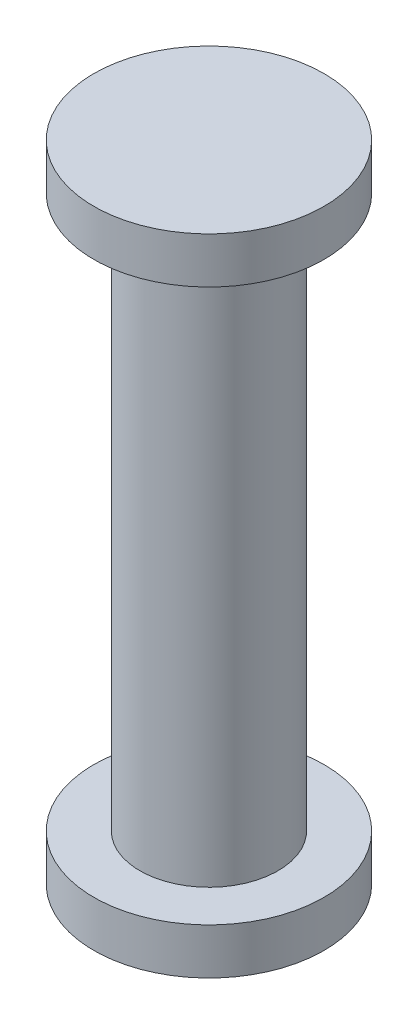
ISO-10303-21;
HEADER;
FILE_DESCRIPTION(('STEP AP214'),'2;1');
FILE_NAME('part.step','',(''),(''),'','','');
FILE_SCHEMA(('AUTOMOTIVE_DESIGN { 1 0 10303 214 1 1 1 1 }'));
ENDSEC;
DATA;
#1=APPLICATION_CONTEXT('core data for automotive mechanical design processes');
#2=APPLICATION_PROTOCOL_DEFINITION('international standard','automotive_design',2000,#1);
#3=PRODUCT_CONTEXT('',#1,'mechanical');
#4=PRODUCT('Part','Part','',(#3));
#5=PRODUCT_RELATED_PRODUCT_CATEGORY('part','',(#4));
#6=PRODUCT_DEFINITION_FORMATION('','',#4);
#7=PRODUCT_DEFINITION_CONTEXT('part definition',#1,'design');
#8=PRODUCT_DEFINITION('design','',#6,#7);
#9=PRODUCT_DEFINITION_SHAPE('','',#8);
#10=(LENGTH_UNIT() NAMED_UNIT(*) SI_UNIT(.MILLI.,.METRE.));
#11=(NAMED_UNIT(*) PLANE_ANGLE_UNIT() SI_UNIT($,.RADIAN.));
#12=(NAMED_UNIT(*) SI_UNIT($,.STERADIAN.) SOLID_ANGLE_UNIT());
#13=UNCERTAINTY_MEASURE_WITH_UNIT(LENGTH_MEASURE(1.E-05),#10,'distance_accuracy_value','');
#14=(GEOMETRIC_REPRESENTATION_CONTEXT(3) GLOBAL_UNCERTAINTY_ASSIGNED_CONTEXT((#13)) GLOBAL_UNIT_ASSIGNED_CONTEXT((#10,
#11,#12)) REPRESENTATION_CONTEXT('',''));
#15=CARTESIAN_POINT('',(0.,0.,0.));
#16=DIRECTION('',(0.,0.,1.));
#17=DIRECTION('',(1.,0.,0.));
#18=AXIS2_PLACEMENT_3D('',#15,#16,#17);
#19=CARTESIAN_POINT('',(-2.5,0.,0.));
#20=DIRECTION('',(0.,1.,0.));
#21=DIRECTION('',(0.,0.,1.));
#22=AXIS2_PLACEMENT_3D('',#19,#20,#21);
#23=PLANE('',#22);
#24=CARTESIAN_POINT('',(0.,0.,0.));
#25=DIRECTION('',(0.,-1.,0.));
#26=DIRECTION('',(0.,0.,-1.));
#27=AXIS2_PLACEMENT_3D('',#24,#25,#26);
#28=CIRCLE('',#27,2.5);
#29=CARTESIAN_POINT('',(0.,0.,-2.5));
#30=VERTEX_POINT('',#29);
#31=EDGE_CURVE('E54',#30,#30,#28,.T.);
#32=ORIENTED_EDGE('',*,*,#31,.T.);
#33=EDGE_LOOP('',(#32));
#34=FACE_BOUND('',#33,.T.);
#35=ADVANCED_FACE('F32',(#34),#23,.F.);
#36=CARTESIAN_POINT('',(0.,14.,0.));
#37=DIRECTION('',(0.,-1.,0.));
#38=DIRECTION('',(0.,0.,-1.));
#39=AXIS2_PLACEMENT_3D('',#36,#37,#38);
#40=PLANE('',#39);
#41=CARTESIAN_POINT('',(0.,14.,0.));
#42=DIRECTION('',(0.,-1.,0.));
#43=DIRECTION('',(0.,0.,-1.));
#44=AXIS2_PLACEMENT_3D('',#41,#42,#43);
#45=CIRCLE('',#44,2.5);
#46=CARTESIAN_POINT('',(0.,14.,-2.5));
#47=VERTEX_POINT('',#46);
#48=EDGE_CURVE('E10',#47,#47,#45,.T.);
#49=ORIENTED_EDGE('',*,*,#48,.F.);
#50=EDGE_LOOP('',(#49));
#51=FACE_BOUND('',#50,.T.);
#52=ADVANCED_FACE('F84',(#51),#40,.F.);
#53=CARTESIAN_POINT('',(0.,0.,0.));
#54=DIRECTION('',(0.,-1.,0.));
#55=DIRECTION('',(0.,0.,-1.));
#56=AXIS2_PLACEMENT_3D('',#53,#54,#55);
#57=CYLINDRICAL_SURFACE('',#56,2.5);
#58=CARTESIAN_POINT('',(0.,13.,0.));
#59=DIRECTION('',(0.,-1.,0.));
#60=DIRECTION('',(0.,0.,-1.));
#61=AXIS2_PLACEMENT_3D('',#58,#59,#60);
#62=CIRCLE('',#61,2.5);
#63=CARTESIAN_POINT('',(0.,13.,-2.5));
#64=VERTEX_POINT('',#63);
#65=EDGE_CURVE('E38',#64,#64,#62,.T.);
#66=ORIENTED_EDGE('',*,*,#65,.F.);
#67=EDGE_LOOP('',(#66));
#68=FACE_BOUND('',#67,.T.);
#69=ORIENTED_EDGE('',*,*,#48,.T.);
#70=EDGE_LOOP('',(#69));
#71=FACE_BOUND('',#70,.T.);
#72=ADVANCED_FACE('F79',(#68,#71),#57,.T.);
#73=CARTESIAN_POINT('',(-2.5,13.,0.));
#74=DIRECTION('',(0.,1.,0.));
#75=DIRECTION('',(0.,0.,1.));
#76=AXIS2_PLACEMENT_3D('',#73,#74,#75);
#77=PLANE('',#76);
#78=CARTESIAN_POINT('',(0.,13.,0.));
#79=DIRECTION('',(0.,-1.,0.));
#80=DIRECTION('',(0.,0.,-1.));
#81=AXIS2_PLACEMENT_3D('',#78,#79,#80);
#82=CIRCLE('',#81,1.5);
#83=CARTESIAN_POINT('',(0.,13.,-1.5));
#84=VERTEX_POINT('',#83);
#85=EDGE_CURVE('E42',#84,#84,#82,.T.);
#86=ORIENTED_EDGE('',*,*,#85,.F.);
#87=EDGE_LOOP('',(#86));
#88=FACE_BOUND('',#87,.T.);
#89=ORIENTED_EDGE('',*,*,#65,.T.);
#90=EDGE_LOOP('',(#89));
#91=FACE_BOUND('',#90,.T.);
#92=ADVANCED_FACE('F74',(#88,#91),#77,.F.);
#93=CARTESIAN_POINT('',(0.,0.,0.));
#94=DIRECTION('',(0.,-1.,0.));
#95=DIRECTION('',(0.,0.,-1.));
#96=AXIS2_PLACEMENT_3D('',#93,#94,#95);
#97=CYLINDRICAL_SURFACE('',#96,1.5);
#98=CARTESIAN_POINT('',(0.,1.,0.));
#99=DIRECTION('',(0.,-1.,0.));
#100=DIRECTION('',(0.,0.,-1.));
#101=AXIS2_PLACEMENT_3D('',#98,#99,#100);
#102=CIRCLE('',#101,1.5);
#103=CARTESIAN_POINT('',(0.,1.,-1.5));
#104=VERTEX_POINT('',#103);
#105=EDGE_CURVE('E46',#104,#104,#102,.T.);
#106=ORIENTED_EDGE('',*,*,#105,.F.);
#107=EDGE_LOOP('',(#106));
#108=FACE_BOUND('',#107,.T.);
#109=ORIENTED_EDGE('',*,*,#85,.T.);
#110=EDGE_LOOP('',(#109));
#111=FACE_BOUND('',#110,.T.);
#112=ADVANCED_FACE('F68',(#108,#111),#97,.T.);
#113=CARTESIAN_POINT('',(-1.5,1.,0.));
#114=DIRECTION('',(0.,-1.,0.));
#115=DIRECTION('',(0.,0.,-1.));
#116=AXIS2_PLACEMENT_3D('',#113,#114,#115);
#117=PLANE('',#116);
#118=CARTESIAN_POINT('',(0.,1.,0.));
#119=DIRECTION('',(0.,-1.,0.));
#120=DIRECTION('',(0.,0.,-1.));
#121=AXIS2_PLACEMENT_3D('',#118,#119,#120);
#122=CIRCLE('',#121,2.5);
#123=CARTESIAN_POINT('',(0.,1.,-2.5));
#124=VERTEX_POINT('',#123);
#125=EDGE_CURVE('E51',#124,#124,#122,.T.);
#126=ORIENTED_EDGE('',*,*,#125,.F.);
#127=EDGE_LOOP('',(#126));
#128=FACE_BOUND('',#127,.T.);
#129=ORIENTED_EDGE('',*,*,#105,.T.);
#130=EDGE_LOOP('',(#129));
#131=FACE_BOUND('',#130,.T.);
#132=ADVANCED_FACE('F62',(#128,#131),#117,.F.);
#133=CARTESIAN_POINT('',(0.,0.,0.));
#134=DIRECTION('',(0.,-1.,0.));
#135=DIRECTION('',(0.,0.,-1.));
#136=AXIS2_PLACEMENT_3D('',#133,#134,#135);
#137=CYLINDRICAL_SURFACE('',#136,2.5);
#138=ORIENTED_EDGE('',*,*,#31,.F.);
#139=EDGE_LOOP('',(#138));
#140=FACE_BOUND('',#139,.T.);
#141=ORIENTED_EDGE('',*,*,#125,.T.);
#142=EDGE_LOOP('',(#141));
#143=FACE_BOUND('',#142,.T.);
#144=ADVANCED_FACE('F59',(#140,#143),#137,.T.);
#145=CLOSED_SHELL('',(#35,#52,#72,#92,#112,#132,#144));
#146=MANIFOLD_SOLID_BREP('B2',#145);
#147=ADVANCED_BREP_SHAPE_REPRESENTATION('',(#18,#146),#14);
#148=SHAPE_DEFINITION_REPRESENTATION(#9,#147);
ENDSEC;
END-ISO-10303-21;
